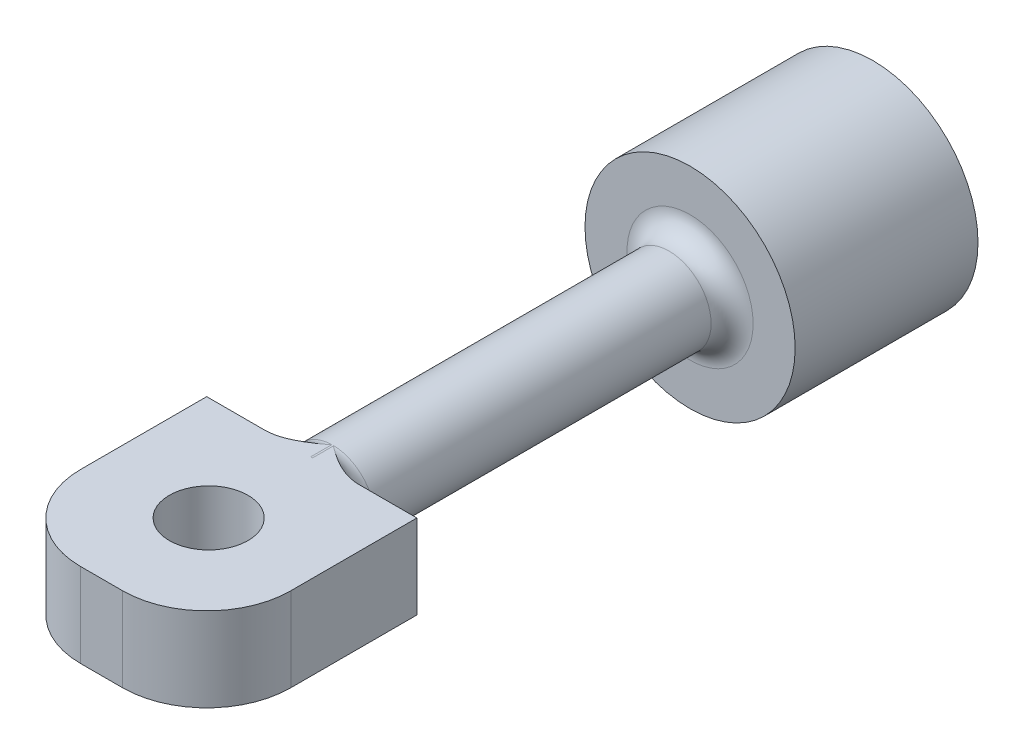
ISO-10303-21;
HEADER;
FILE_DESCRIPTION(('STEP AP214'),'2;1');
FILE_NAME('part.step','',(''),(''),'','','');
FILE_SCHEMA(('AUTOMOTIVE_DESIGN { 1 0 10303 214 1 1 1 1 }'));
ENDSEC;
DATA;
#1=APPLICATION_CONTEXT('core data for automotive mechanical design processes');
#2=APPLICATION_PROTOCOL_DEFINITION('international standard','automotive_design',2000,#1);
#3=PRODUCT_CONTEXT('',#1,'mechanical');
#4=PRODUCT('Part','Part','',(#3));
#5=PRODUCT_RELATED_PRODUCT_CATEGORY('part','',(#4));
#6=PRODUCT_DEFINITION_FORMATION('','',#4);
#7=PRODUCT_DEFINITION_CONTEXT('part definition',#1,'design');
#8=PRODUCT_DEFINITION('design','',#6,#7);
#9=PRODUCT_DEFINITION_SHAPE('','',#8);
#10=(LENGTH_UNIT() NAMED_UNIT(*) SI_UNIT(.MILLI.,.METRE.));
#11=(NAMED_UNIT(*) PLANE_ANGLE_UNIT() SI_UNIT($,.RADIAN.));
#12=(NAMED_UNIT(*) SI_UNIT($,.STERADIAN.) SOLID_ANGLE_UNIT());
#13=UNCERTAINTY_MEASURE_WITH_UNIT(LENGTH_MEASURE(1.E-05),#10,'distance_accuracy_value','');
#14=(GEOMETRIC_REPRESENTATION_CONTEXT(3) GLOBAL_UNCERTAINTY_ASSIGNED_CONTEXT((#13)) GLOBAL_UNIT_ASSIGNED_CONTEXT((#10,
#11,#12)) REPRESENTATION_CONTEXT('',''));
#15=CARTESIAN_POINT('',(0.,0.,0.));
#16=DIRECTION('',(0.,0.,1.));
#17=DIRECTION('',(1.,0.,0.));
#18=AXIS2_PLACEMENT_3D('',#15,#16,#17);
#19=CARTESIAN_POINT('',(-5.60926471851396,0.,11.049));
#20=DIRECTION('',(0.,0.,-1.));
#21=DIRECTION('',(-1.,0.,0.));
#22=AXIS2_PLACEMENT_3D('',#19,#20,#21);
#23=CYLINDRICAL_SURFACE('',#22,6.35);
#24=CARTESIAN_POINT('',(-5.60926471851396,0.,11.049));
#25=DIRECTION('',(0.,0.,1.));
#26=DIRECTION('',(1.,0.,0.));
#27=AXIS2_PLACEMENT_3D('',#24,#25,#26);
#28=CIRCLE('',#27,6.35);
#29=CARTESIAN_POINT('',(0.740735281486041,0.,11.049));
#30=VERTEX_POINT('',#29);
#31=EDGE_CURVE('E201',#30,#30,#28,.T.);
#32=ORIENTED_EDGE('',*,*,#31,.F.);
#33=EDGE_LOOP('',(#32));
#34=FACE_BOUND('',#33,.T.);
#35=CARTESIAN_POINT('',(-5.60926471851396,0.,0.));
#36=DIRECTION('',(0.,0.,1.));
#37=DIRECTION('',(1.,0.,0.));
#38=AXIS2_PLACEMENT_3D('',#35,#36,#37);
#39=CIRCLE('',#38,6.35);
#40=CARTESIAN_POINT('',(0.740735281486041,0.,0.));
#41=VERTEX_POINT('',#40);
#42=EDGE_CURVE('E145',#41,#41,#39,.T.);
#43=ORIENTED_EDGE('',*,*,#42,.T.);
#44=EDGE_LOOP('',(#43));
#45=FACE_BOUND('',#44,.T.);
#46=ADVANCED_FACE('F34',(#34,#45),#23,.T.);
#47=CARTESIAN_POINT('',(-5.60926471851396,0.,11.049));
#48=DIRECTION('',(0.,0.,1.));
#49=DIRECTION('',(1.,0.,0.));
#50=AXIS2_PLACEMENT_3D('',#47,#48,#49);
#51=PLANE('',#50);
#52=CARTESIAN_POINT('',(-5.60926471851396,0.,11.049));
#53=DIRECTION('',(0.,0.,1.));
#54=DIRECTION('',(1.,0.,0.));
#55=AXIS2_PLACEMENT_3D('',#52,#53,#54);
#56=CIRCLE('',#55,3.81);
#57=CARTESIAN_POINT('',(-1.79926471851396,0.,11.049));
#58=VERTEX_POINT('',#57);
#59=EDGE_CURVE('E181',#58,#58,#56,.F.);
#60=ORIENTED_EDGE('',*,*,#59,.T.);
#61=EDGE_LOOP('',(#60));
#62=FACE_BOUND('',#61,.T.);
#63=ORIENTED_EDGE('',*,*,#31,.T.);
#64=EDGE_LOOP('',(#63));
#65=FACE_BOUND('',#64,.T.);
#66=ADVANCED_FACE('F228',(#62,#65),#51,.T.);
#67=CARTESIAN_POINT('',(-5.60926471851396,0.,0.));
#68=DIRECTION('',(0.,0.,1.));
#69=DIRECTION('',(1.,0.,0.));
#70=AXIS2_PLACEMENT_3D('',#67,#68,#69);
#71=PLANE('',#70);
#72=ORIENTED_EDGE('',*,*,#42,.F.);
#73=EDGE_LOOP('',(#72));
#74=FACE_BOUND('',#73,.T.);
#75=ADVANCED_FACE('F225',(#74),#71,.F.);
#76=CARTESIAN_POINT('',(-5.60926471851396,0.,33.909));
#77=DIRECTION('',(0.,0.,-1.));
#78=DIRECTION('',(-1.,0.,0.));
#79=AXIS2_PLACEMENT_3D('',#76,#77,#78);
#80=CYLINDRICAL_SURFACE('',#79,2.54);
#81=CARTESIAN_POINT('',(-5.60926471851396,0.,12.319));
#82=DIRECTION('',(0.,0.,1.));
#83=DIRECTION('',(1.,0.,0.));
#84=AXIS2_PLACEMENT_3D('',#81,#82,#83);
#85=CIRCLE('',#84,2.54);
#86=CARTESIAN_POINT('',(-3.06926471851396,0.,12.319));
#87=VERTEX_POINT('',#86);
#88=EDGE_CURVE('E280',#87,#87,#85,.T.);
#89=ORIENTED_EDGE('',*,*,#88,.T.);
#90=EDGE_LOOP('',(#89));
#91=FACE_BOUND('',#90,.T.);
#92=CARTESIAN_POINT('',(-5.66598428214727,-2.53936663187915,33.909));
#93=DIRECTION('',(1.,0.,0.));
#94=VECTOR('',#93,1.);
#95=LINE('',#92,#94);
#96=CARTESIAN_POINT('',(-5.66598428214727,-2.53936663187915,33.909));
#97=VERTEX_POINT('',#96);
#98=CARTESIAN_POINT('',(-5.55254515488065,-2.53936663187915,33.909));
#99=VERTEX_POINT('',#98);
#100=EDGE_CURVE('E242',#97,#99,#95,.T.);
#101=ORIENTED_EDGE('',*,*,#100,.F.);
#102=DIRECTION('',(0.,0.,-1.));
#103=VECTOR('',#102,1.);
#104=CARTESIAN_POINT('',(-5.66598428214727,-2.53936663187915,33.909));
#105=LINE('',#104,#103);
#106=CARTESIAN_POINT('',(-5.66598428214725,-2.53936663187915,32.6389999999969));
#107=VERTEX_POINT('',#106);
#108=EDGE_CURVE('E63',#97,#107,#105,.T.);
#109=ORIENTED_EDGE('',*,*,#108,.T.);
#110=CARTESIAN_POINT('',(-5.60926471851396,0.,32.639));
#111=DIRECTION('',(0.,0.,1.));
#112=DIRECTION('',(1.,0.,0.));
#113=AXIS2_PLACEMENT_3D('',#110,#111,#112);
#114=CIRCLE('',#113,2.54);
#115=CARTESIAN_POINT('',(-7.50284652250328,1.69291108791943,32.639));
#116=VERTEX_POINT('',#115);
#117=EDGE_CURVE('E277',#107,#116,#114,.F.);
#118=ORIENTED_EDGE('',*,*,#117,.T.);
#119=CARTESIAN_POINT('',(-5.60926471851396,0.,32.639));
#120=DIRECTION('',(0.,0.,1.));
#121=DIRECTION('',(1.,0.,0.));
#122=AXIS2_PLACEMENT_3D('',#119,#120,#121);
#123=CIRCLE('',#122,2.54);
#124=CARTESIAN_POINT('',(-5.66598428214731,2.53936663187915,32.6389999999969));
#125=VERTEX_POINT('',#124);
#126=EDGE_CURVE('E272',#116,#125,#123,.F.);
#127=ORIENTED_EDGE('',*,*,#126,.T.);
#128=DIRECTION('',(0.,0.,-1.));
#129=VECTOR('',#128,1.);
#130=CARTESIAN_POINT('',(-5.66598428214731,2.53936663187915,33.909));
#131=LINE('',#130,#129);
#132=CARTESIAN_POINT('',(-5.66598428214731,2.53936663187915,33.909));
#133=VERTEX_POINT('',#132);
#134=EDGE_CURVE('E268',#125,#133,#131,.F.);
#135=ORIENTED_EDGE('',*,*,#134,.T.);
#136=CARTESIAN_POINT('',(-5.55254515488061,2.53936663187915,33.909));
#137=DIRECTION('',(-1.,0.,0.));
#138=VECTOR('',#137,1.);
#139=LINE('',#136,#138);
#140=CARTESIAN_POINT('',(-5.55254515488061,2.53936663187915,33.909));
#141=VERTEX_POINT('',#140);
#142=EDGE_CURVE('E204',#141,#133,#139,.T.);
#143=ORIENTED_EDGE('',*,*,#142,.F.);
#144=DIRECTION('',(0.,0.,-1.));
#145=VECTOR('',#144,1.);
#146=CARTESIAN_POINT('',(-5.55254515488061,2.53936663187915,33.909));
#147=LINE('',#146,#145);
#148=CARTESIAN_POINT('',(-5.5525451548806,2.53936663187915,32.6389999999969));
#149=VERTEX_POINT('',#148);
#150=EDGE_CURVE('E55',#141,#149,#147,.T.);
#151=ORIENTED_EDGE('',*,*,#150,.T.);
#152=CARTESIAN_POINT('',(-5.60926471851396,0.,32.639));
#153=DIRECTION('',(0.,0.,1.));
#154=DIRECTION('',(1.,0.,0.));
#155=AXIS2_PLACEMENT_3D('',#152,#153,#154);
#156=CIRCLE('',#155,2.54);
#157=CARTESIAN_POINT('',(-3.71568291452464,-1.69291108791943,32.639));
#158=VERTEX_POINT('',#157);
#159=EDGE_CURVE('E265',#149,#158,#156,.F.);
#160=ORIENTED_EDGE('',*,*,#159,.T.);
#161=CARTESIAN_POINT('',(-5.60926471851396,0.,32.639));
#162=DIRECTION('',(0.,0.,1.));
#163=DIRECTION('',(1.,0.,0.));
#164=AXIS2_PLACEMENT_3D('',#161,#162,#163);
#165=CIRCLE('',#164,2.54);
#166=CARTESIAN_POINT('',(-5.55254515488065,-2.53936663187915,32.6389999999969));
#167=VERTEX_POINT('',#166);
#168=EDGE_CURVE('E260',#158,#167,#165,.F.);
#169=ORIENTED_EDGE('',*,*,#168,.T.);
#170=DIRECTION('',(0.,0.,-1.));
#171=VECTOR('',#170,1.);
#172=CARTESIAN_POINT('',(-5.55254515488065,-2.53936663187915,33.909));
#173=LINE('',#172,#171);
#174=EDGE_CURVE('E258',#167,#99,#173,.F.);
#175=ORIENTED_EDGE('',*,*,#174,.T.);
#176=EDGE_LOOP('',(#101,#109,#118,#127,#135,#143,#151,#160,#169,#175));
#177=FACE_BOUND('',#176,.T.);
#178=ADVANCED_FACE('F214',(#91,#177),#80,.T.);
#179=CARTESIAN_POINT('',(0.,0.,33.909));
#180=DIRECTION('',(0.,0.,1.));
#181=DIRECTION('',(1.,0.,0.));
#182=AXIS2_PLACEMENT_3D('',#179,#180,#181);
#183=PLANE('',#182);
#184=DIRECTION('',(-1.,0.,0.));
#185=VECTOR('',#184,1.);
#186=CARTESIAN_POINT('',(-11.959264718514,2.53936663187915,33.909));
#187=LINE('',#186,#185);
#188=CARTESIAN_POINT('',(-8.44963742449794,2.53936663187915,33.909));
#189=VERTEX_POINT('',#188);
#190=CARTESIAN_POINT('',(-11.959264718514,2.53936663187915,33.909));
#191=VERTEX_POINT('',#190);
#192=EDGE_CURVE('E157',#189,#191,#187,.T.);
#193=ORIENTED_EDGE('',*,*,#192,.F.);
#194=CARTESIAN_POINT('',(-5.60926471851396,0.,33.909));
#195=DIRECTION('',(0.,0.,1.));
#196=DIRECTION('',(1.,0.,0.));
#197=AXIS2_PLACEMENT_3D('',#194,#195,#196);
#198=CIRCLE('',#197,3.81);
#199=CARTESIAN_POINT('',(-8.44963742449794,-2.53936663187915,33.909));
#200=VERTEX_POINT('',#199);
#201=EDGE_CURVE('E183',#189,#200,#198,.T.);
#202=ORIENTED_EDGE('',*,*,#201,.T.);
#203=DIRECTION('',(1.,0.,0.));
#204=VECTOR('',#203,1.);
#205=CARTESIAN_POINT('',(-11.959264718514,-2.53936663187915,33.909));
#206=LINE('',#205,#204);
#207=CARTESIAN_POINT('',(-11.959264718514,-2.53936663187915,33.909));
#208=VERTEX_POINT('',#207);
#209=EDGE_CURVE('E188',#208,#200,#206,.T.);
#210=ORIENTED_EDGE('',*,*,#209,.F.);
#211=DIRECTION('',(0.,-1.,0.));
#212=VECTOR('',#211,1.);
#213=CARTESIAN_POINT('',(-11.959264718514,2.53936663187915,33.909));
#214=LINE('',#213,#212);
#215=EDGE_CURVE('E156',#191,#208,#214,.T.);
#216=ORIENTED_EDGE('',*,*,#215,.F.);
#217=EDGE_LOOP('',(#193,#202,#210,#216));
#218=FACE_BOUND('',#217,.T.);
#219=ADVANCED_FACE('F224',(#218),#183,.F.);
#220=CARTESIAN_POINT('',(-2.76889201252998,-2.53936663187915,33.909));
#221=VERTEX_POINT('',#220);
#222=CARTESIAN_POINT('',(0.740735281486043,-2.53936663187915,33.909));
#223=VERTEX_POINT('',#222);
#224=EDGE_CURVE('E186',#221,#223,#206,.T.);
#225=ORIENTED_EDGE('',*,*,#224,.F.);
#226=CARTESIAN_POINT('',(-5.60926471851396,0.,33.909));
#227=DIRECTION('',(0.,0.,1.));
#228=DIRECTION('',(1.,0.,0.));
#229=AXIS2_PLACEMENT_3D('',#226,#227,#228);
#230=CIRCLE('',#229,3.81);
#231=CARTESIAN_POINT('',(-2.76889201252998,2.53936663187915,33.909));
#232=VERTEX_POINT('',#231);
#233=EDGE_CURVE('E155',#221,#232,#230,.T.);
#234=ORIENTED_EDGE('',*,*,#233,.T.);
#235=CARTESIAN_POINT('',(0.740735281486043,2.53936663187915,33.909));
#236=VERTEX_POINT('',#235);
#237=EDGE_CURVE('E139',#236,#232,#187,.T.);
#238=ORIENTED_EDGE('',*,*,#237,.F.);
#239=DIRECTION('',(0.,1.,0.));
#240=VECTOR('',#239,1.);
#241=CARTESIAN_POINT('',(0.740735281486043,2.53936663187915,33.909));
#242=LINE('',#241,#240);
#243=EDGE_CURVE('E153',#223,#236,#242,.T.);
#244=ORIENTED_EDGE('',*,*,#243,.F.);
#245=EDGE_LOOP('',(#225,#234,#238,#244));
#246=FACE_BOUND('',#245,.T.);
#247=ADVANCED_FACE('F152',(#246),#183,.F.);
#248=CARTESIAN_POINT('',(0.740735281486043,2.53936663187915,46.609));
#249=DIRECTION('',(-1.,0.,0.));
#250=DIRECTION('',(0.,-1.,0.));
#251=AXIS2_PLACEMENT_3D('',#248,#249,#250);
#252=PLANE('',#251);
#253=DIRECTION('',(0.,0.,-1.));
#254=VECTOR('',#253,1.);
#255=CARTESIAN_POINT('',(0.740735281486043,2.53936663187915,46.609));
#256=LINE('',#255,#254);
#257=CARTESIAN_POINT('',(0.740735281486043,2.53936663187915,41.529));
#258=VERTEX_POINT('',#257);
#259=EDGE_CURVE('E135',#258,#236,#256,.T.);
#260=ORIENTED_EDGE('',*,*,#259,.F.);
#261=DIRECTION('',(0.,1.,0.));
#262=VECTOR('',#261,1.);
#263=CARTESIAN_POINT('',(0.740735281486042,-2.53936663187915,41.529));
#264=LINE('',#263,#262);
#265=CARTESIAN_POINT('',(0.740735281486043,-2.53936663187915,41.529));
#266=VERTEX_POINT('',#265);
#267=EDGE_CURVE('E244',#258,#266,#264,.F.);
#268=ORIENTED_EDGE('',*,*,#267,.T.);
#269=DIRECTION('',(0.,0.,-1.));
#270=VECTOR('',#269,1.);
#271=CARTESIAN_POINT('',(0.740735281486043,-2.53936663187915,46.609));
#272=LINE('',#271,#270);
#273=EDGE_CURVE('E162',#266,#223,#272,.T.);
#274=ORIENTED_EDGE('',*,*,#273,.T.);
#275=ORIENTED_EDGE('',*,*,#243,.T.);
#276=EDGE_LOOP('',(#260,#268,#274,#275));
#277=FACE_BOUND('',#276,.T.);
#278=ADVANCED_FACE('F160',(#277),#252,.F.);
#279=CARTESIAN_POINT('',(-11.959264718514,2.53936663187915,46.609));
#280=DIRECTION('',(0.,-1.,0.));
#281=DIRECTION('',(0.,0.,-1.));
#282=AXIS2_PLACEMENT_3D('',#279,#280,#281);
#283=PLANE('',#282);
#284=CARTESIAN_POINT('',(-5.55254515488065,2.53936663187915,40.1977087468333));
#285=DIRECTION('',(0.,-1.,0.));
#286=DIRECTION('',(0.,0.,-1.));
#287=AXIS2_PLACEMENT_3D('',#284,#285,#286);
#288=CIRCLE('',#287,2.3749);
#289=CARTESIAN_POINT('',(-5.55254515488065,2.53936663187915,37.8228087468333));
#290=VERTEX_POINT('',#289);
#291=EDGE_CURVE('E163',#290,#290,#288,.T.);
#292=ORIENTED_EDGE('',*,*,#291,.T.);
#293=EDGE_LOOP('',(#292));
#294=FACE_BOUND('',#293,.T.);
#295=DIRECTION('',(0.,0.,-1.));
#296=VECTOR('',#295,1.);
#297=CARTESIAN_POINT('',(-11.959264718514,2.53936663187915,46.609));
#298=LINE('',#297,#296);
#299=CARTESIAN_POINT('',(-11.959264718514,2.53936663187915,41.529));
#300=VERTEX_POINT('',#299);
#301=EDGE_CURVE('E146',#300,#191,#298,.T.);
#302=ORIENTED_EDGE('',*,*,#301,.F.);
#303=CARTESIAN_POINT('',(-6.87926471851396,2.53936663187915,41.529));
#304=DIRECTION('',(0.,-1.,0.));
#305=DIRECTION('',(0.,0.,-1.));
#306=AXIS2_PLACEMENT_3D('',#303,#304,#305);
#307=CIRCLE('',#306,5.08);
#308=CARTESIAN_POINT('',(-6.87926471851396,2.53936663187915,46.609));
#309=VERTEX_POINT('',#308);
#310=EDGE_CURVE('E256',#300,#309,#307,.F.);
#311=ORIENTED_EDGE('',*,*,#310,.T.);
#312=DIRECTION('',(-1.,0.,0.));
#313=VECTOR('',#312,1.);
#314=CARTESIAN_POINT('',(-11.959264718514,2.53936663187915,46.609));
#315=LINE('',#314,#313);
#316=CARTESIAN_POINT('',(-4.33926471851396,2.53936663187915,46.609));
#317=VERTEX_POINT('',#316);
#318=EDGE_CURVE('E198',#317,#309,#315,.T.);
#319=ORIENTED_EDGE('',*,*,#318,.F.);
#320=CARTESIAN_POINT('',(-4.33926471851396,2.53936663187915,41.529));
#321=DIRECTION('',(0.,-1.,0.));
#322=DIRECTION('',(0.,0.,-1.));
#323=AXIS2_PLACEMENT_3D('',#320,#321,#322);
#324=CIRCLE('',#323,5.08);
#325=EDGE_CURVE('E141',#317,#258,#324,.F.);
#326=ORIENTED_EDGE('',*,*,#325,.T.);
#327=ORIENTED_EDGE('',*,*,#259,.T.);
#328=ORIENTED_EDGE('',*,*,#237,.T.);
#329=CARTESIAN_POINT('',(-2.76889201252998,2.53936663187915,33.909));
#330=CARTESIAN_POINT('',(-2.84423560732069,2.53936663187915,33.9089934884778));
#331=CARTESIAN_POINT('',(-2.91948919888659,2.53936663187915,33.9052759550835));
#332=CARTESIAN_POINT('',(-3.069234043186,2.53936663187915,33.8911985392594));
#333=CARTESIAN_POINT('',(-3.14372650338977,2.53936663187915,33.8808517240487));
#334=CARTESIAN_POINT('',(-3.36334254317644,2.53936663187915,33.8414200201185));
#335=CARTESIAN_POINT('',(-3.5069627191833,2.53936663187915,33.8038931842056));
#336=CARTESIAN_POINT('',(-3.80012693225158,2.53936663187915,33.7075924681036));
#337=CARTESIAN_POINT('',(-3.94914602269863,2.53936663187915,33.647291140177));
#338=CARTESIAN_POINT('',(-4.24043046150844,2.53936663187915,33.5119465551635));
#339=CARTESIAN_POINT('',(-4.38268563502947,2.53936663187915,33.4368819100256));
#340=CARTESIAN_POINT('',(-4.59223486458456,2.53936663187915,33.3165041409795));
#341=CARTESIAN_POINT('',(-4.66172108169451,2.53936663187915,33.2748956240633));
#342=CARTESIAN_POINT('',(-4.79945111824655,2.53936663187915,33.1896553124171));
#343=CARTESIAN_POINT('',(-4.86769486827937,2.53936663187915,33.1460234051324));
#344=CARTESIAN_POINT('',(-5.00313014252779,2.53936663187915,33.0572012191372));
#345=CARTESIAN_POINT('',(-5.07032187907455,2.53936663187915,33.0120112609459));
#346=CARTESIAN_POINT('',(-5.20391994508621,2.53936663187915,32.9204884069758));
#347=CARTESIAN_POINT('',(-5.27032637076926,2.53936663187915,32.8741556534069));
#348=CARTESIAN_POINT('',(-5.35824781246202,2.53936663187915,32.8113425500245));
#349=CARTESIAN_POINT('',(-5.38023786834609,2.53936663187915,32.7955080218613));
#350=CARTESIAN_POINT('',(-5.42402444091623,2.53936663187915,32.7635779359338));
#351=CARTESIAN_POINT('',(-5.44582110730311,2.53936663187915,32.7474826134799));
#352=CARTESIAN_POINT('',(-5.48108532969871,2.53936663187915,32.7203121831764));
#353=CARTESIAN_POINT('',(-5.49476386300353,2.53936663187915,32.7094823545308));
#354=CARTESIAN_POINT('',(-5.51903527841538,2.53936663187915,32.6889650593524));
#355=CARTESIAN_POINT('',(-5.52973023432136,2.53936663187915,32.6794378105377));
#356=CARTESIAN_POINT('',(-5.5404262783471,2.53936663187915,32.6666121425604));
#357=CARTESIAN_POINT('',(-5.54196052221437,2.53936663187915,32.6646731049957));
#358=CARTESIAN_POINT('',(-5.5448519041327,2.53936663187915,32.6606573995403));
#359=CARTESIAN_POINT('',(-5.54620859606639,2.53936663187915,32.658580404014));
#360=CARTESIAN_POINT('',(-5.54866583625015,2.53936663187915,32.6542187032587));
#361=CARTESIAN_POINT('',(-5.54976071612866,2.53936663187915,32.6519306735014));
#362=CARTESIAN_POINT('',(-5.55146411819525,2.53936663187915,32.6471869816589));
#363=CARTESIAN_POINT('',(-5.55207675240667,2.53936663187915,32.6447329350068));
#364=CARTESIAN_POINT('',(-5.55255028452025,2.53936663187915,32.6405707843463));
#365=CARTESIAN_POINT('',(-5.55259225339786,2.53936663187915,32.638883047985));
#366=CARTESIAN_POINT('',(-5.55238259641826,2.53936663187915,32.6354969795305));
#367=CARTESIAN_POINT('',(-5.55212596505789,2.53936663187915,32.6337989554248));
#368=CARTESIAN_POINT('',(-5.55172076806956,2.53936663187915,32.6321371907176));
#369=B_SPLINE_CURVE_WITH_KNOTS('',3,(#329,#330,#331,#332,#333,#334,#335,#336,#337,#338,#339,
#340,#341,#342,#343,#344,#345,#346,#347,#348,#349,#350,#351,#352,#353,#354,#355,#356,#357,#358,
#359,#360,#361,#362,#363,#364,#365,#366,#367,#368),.UNSPECIFIED.,.F.,.F.,(4,2,2,2,2,2,2,2,2,2,2,
2,2,2,2,2,2,2,2,4),(0.,0.225800225922263,0.451156732381619,0.894881992238086,1.37610273574317,
1.85802584258481,2.10097699275592,2.34394167378183,2.58685666735858,2.82974158345917,
2.911045607328,2.99227995975572,3.04468826246365,3.08738451368471,3.09479489589499,
3.10222355389191,3.1098008525602,3.11731281911959,3.12235201513204,3.12747691614164),.UNSPECIFIED.);
#370=EDGE_CURVE('E48',#232,#149,#369,.T.);
#371=ORIENTED_EDGE('',*,*,#370,.T.);
#372=ORIENTED_EDGE('',*,*,#150,.F.);
#373=ORIENTED_EDGE('',*,*,#142,.T.);
#374=ORIENTED_EDGE('',*,*,#134,.F.);
#375=CARTESIAN_POINT('',(-8.44963742449794,2.53936663187915,33.909));
#376=CARTESIAN_POINT('',(-8.37429382970722,2.53936663187915,33.9089934884778));
#377=CARTESIAN_POINT('',(-8.29904023814133,2.53936663187915,33.9052759550835));
#378=CARTESIAN_POINT('',(-8.14929539384192,2.53936663187915,33.8911985392594));
#379=CARTESIAN_POINT('',(-8.07480293363814,2.53936663187915,33.8808517240487));
#380=CARTESIAN_POINT('',(-7.85518689385148,2.53936663187915,33.8414200201185));
#381=CARTESIAN_POINT('',(-7.71156671784462,2.53936663187915,33.8038931842056));
#382=CARTESIAN_POINT('',(-7.41840250477635,2.53936663187915,33.7075924681036));
#383=CARTESIAN_POINT('',(-7.2693834143293,2.53936663187915,33.647291140177));
#384=CARTESIAN_POINT('',(-6.97809897551949,2.53936663187915,33.5119465551635));
#385=CARTESIAN_POINT('',(-6.83584380199847,2.53936663187915,33.4368819100256));
#386=CARTESIAN_POINT('',(-6.62629457244338,2.53936663187915,33.3165041409795));
#387=CARTESIAN_POINT('',(-6.55680835533344,2.53936663187915,33.2748956240633));
#388=CARTESIAN_POINT('',(-6.4190783187814,2.53936663187915,33.1896553124172));
#389=CARTESIAN_POINT('',(-6.35083456874858,2.53936663187915,33.1460234051324));
#390=CARTESIAN_POINT('',(-6.21539929450016,2.53936663187915,33.0572012191372));
#391=CARTESIAN_POINT('',(-6.14820755795341,2.53936663187915,33.012011260946));
#392=CARTESIAN_POINT('',(-6.01460949194175,2.53936663187915,32.9204884069758));
#393=CARTESIAN_POINT('',(-5.9482030662587,2.53936663187915,32.874155653407));
#394=CARTESIAN_POINT('',(-5.86028162456596,2.53936663187915,32.8113425500246));
#395=CARTESIAN_POINT('',(-5.83829156868191,2.53936663187915,32.7955080218613));
#396=CARTESIAN_POINT('',(-5.79450499611179,2.53936663187915,32.7635779359339));
#397=CARTESIAN_POINT('',(-5.77270832972493,2.53936663187915,32.74748261348));
#398=CARTESIAN_POINT('',(-5.73744410732932,2.53936663187915,32.7203121831765));
#399=CARTESIAN_POINT('',(-5.72376557402448,2.53936663187915,32.7094823545309));
#400=CARTESIAN_POINT('',(-5.69949415861263,2.53936663187915,32.6889650593525));
#401=CARTESIAN_POINT('',(-5.68879920270666,2.53936663187915,32.6794378105378));
#402=CARTESIAN_POINT('',(-5.67810315868093,2.53936663187915,32.6666121425605));
#403=CARTESIAN_POINT('',(-5.67656891481367,2.53936663187915,32.6646731049958));
#404=CARTESIAN_POINT('',(-5.67367753289533,2.53936663187915,32.6606573995404));
#405=CARTESIAN_POINT('',(-5.67232084096163,2.53936663187915,32.6585804040142));
#406=CARTESIAN_POINT('',(-5.66986360077784,2.53936663187915,32.6542187032589));
#407=CARTESIAN_POINT('',(-5.66876872089932,2.53936663187915,32.6519306735016));
#408=CARTESIAN_POINT('',(-5.66706531883271,2.53936663187915,32.6471869816591));
#409=CARTESIAN_POINT('',(-5.6664526846213,2.53936663187915,32.6447329350069));
#410=CARTESIAN_POINT('',(-5.6659791525077,2.53936663187915,32.6405707843465));
#411=CARTESIAN_POINT('',(-5.66593718363007,2.53936663187915,32.6388830479852));
#412=CARTESIAN_POINT('',(-5.66614684060964,2.53936663187915,32.6354969795307));
#413=CARTESIAN_POINT('',(-5.66640347196999,2.53936663187915,32.6337989554249));
#414=CARTESIAN_POINT('',(-5.6668086689583,2.53936663187915,32.6321371907177));
#415=B_SPLINE_CURVE_WITH_KNOTS('',3,(#375,#376,#377,#378,#379,#380,#381,#382,#383,#384,#385,
#386,#387,#388,#389,#390,#391,#392,#393,#394,#395,#396,#397,#398,#399,#400,#401,#402,#403,#404,
#405,#406,#407,#408,#409,#410,#411,#412,#413,#414),.UNSPECIFIED.,.F.,.F.,(4,2,2,2,2,2,2,2,2,2,2,
2,2,2,2,2,2,2,2,4),(0.,0.225800225922262,0.451156732381618,0.894881992238086,1.37610273574316,
1.85802584258479,2.10097699275588,2.34394167378179,2.58685666735853,2.82974158345911,
2.91104560732788,2.99227995975555,3.04468826246356,3.08738451368452,3.09479489589481,
3.10222355389174,3.10980085256005,3.11731281911945,3.12235201513189,3.12747691614149),.UNSPECIFIED.);
#416=EDGE_CURVE('E353',#125,#189,#415,.F.);
#417=ORIENTED_EDGE('',*,*,#416,.T.);
#418=ORIENTED_EDGE('',*,*,#192,.T.);
#419=EDGE_LOOP('',(#302,#311,#319,#326,#327,#328,#371,#372,#373,#374,#417,#418));
#420=FACE_BOUND('',#419,.T.);
#421=ADVANCED_FACE('F138',(#294,#420),#283,.F.);
#422=CARTESIAN_POINT('',(-11.959264718514,2.53936663187915,46.609));
#423=DIRECTION('',(1.,0.,0.));
#424=DIRECTION('',(0.,0.,-1.));
#425=AXIS2_PLACEMENT_3D('',#422,#423,#424);
#426=PLANE('',#425);
#427=DIRECTION('',(0.,0.,-1.));
#428=VECTOR('',#427,1.);
#429=CARTESIAN_POINT('',(-11.959264718514,-2.53936663187915,46.609));
#430=LINE('',#429,#428);
#431=CARTESIAN_POINT('',(-11.959264718514,-2.53936663187915,41.529));
#432=VERTEX_POINT('',#431);
#433=EDGE_CURVE('E325',#432,#208,#430,.T.);
#434=ORIENTED_EDGE('',*,*,#433,.F.);
#435=DIRECTION('',(0.,-1.,0.));
#436=VECTOR('',#435,1.);
#437=CARTESIAN_POINT('',(-11.959264718514,2.53936663187915,41.529));
#438=LINE('',#437,#436);
#439=EDGE_CURVE('E254',#432,#300,#438,.F.);
#440=ORIENTED_EDGE('',*,*,#439,.T.);
#441=ORIENTED_EDGE('',*,*,#301,.T.);
#442=ORIENTED_EDGE('',*,*,#215,.T.);
#443=EDGE_LOOP('',(#434,#440,#441,#442));
#444=FACE_BOUND('',#443,.T.);
#445=ADVANCED_FACE('F335',(#444),#426,.F.);
#446=CARTESIAN_POINT('',(-11.959264718514,-2.53936663187915,46.609));
#447=DIRECTION('',(0.,1.,0.));
#448=DIRECTION('',(0.,0.,1.));
#449=AXIS2_PLACEMENT_3D('',#446,#447,#448);
#450=PLANE('',#449);
#451=CARTESIAN_POINT('',(-5.55254515488065,-2.53936663187915,40.1977087468333));
#452=DIRECTION('',(0.,-1.,0.));
#453=DIRECTION('',(0.,0.,-1.));
#454=AXIS2_PLACEMENT_3D('',#451,#452,#453);
#455=CIRCLE('',#454,2.3749);
#456=CARTESIAN_POINT('',(-5.55254515488065,-2.53936663187915,37.8228087468333));
#457=VERTEX_POINT('',#456);
#458=EDGE_CURVE('E167',#457,#457,#455,.T.);
#459=ORIENTED_EDGE('',*,*,#458,.F.);
#460=EDGE_LOOP('',(#459));
#461=FACE_BOUND('',#460,.T.);
#462=DIRECTION('',(1.,0.,0.));
#463=VECTOR('',#462,1.);
#464=CARTESIAN_POINT('',(-11.959264718514,-2.53936663187915,46.609));
#465=LINE('',#464,#463);
#466=CARTESIAN_POINT('',(-6.87926471851396,-2.53936663187915,46.609));
#467=VERTEX_POINT('',#466);
#468=CARTESIAN_POINT('',(-4.33926471851396,-2.53936663187915,46.609));
#469=VERTEX_POINT('',#468);
#470=EDGE_CURVE('E171',#467,#469,#465,.T.);
#471=ORIENTED_EDGE('',*,*,#470,.F.);
#472=CARTESIAN_POINT('',(-6.87926471851396,-2.53936663187915,41.529));
#473=DIRECTION('',(0.,1.,0.));
#474=DIRECTION('',(0.,0.,1.));
#475=AXIS2_PLACEMENT_3D('',#472,#473,#474);
#476=CIRCLE('',#475,5.08);
#477=EDGE_CURVE('E252',#467,#432,#476,.F.);
#478=ORIENTED_EDGE('',*,*,#477,.T.);
#479=ORIENTED_EDGE('',*,*,#433,.T.);
#480=ORIENTED_EDGE('',*,*,#209,.T.);
#481=CARTESIAN_POINT('',(-8.44963742449794,-2.53936663187915,33.909));
#482=CARTESIAN_POINT('',(-8.37429382970722,-2.53936663187915,33.9089934884778));
#483=CARTESIAN_POINT('',(-8.29904023814133,-2.53936663187915,33.9052759550835));
#484=CARTESIAN_POINT('',(-8.14929539384192,-2.53936663187915,33.8911985392594));
#485=CARTESIAN_POINT('',(-8.07480293363814,-2.53936663187915,33.8808517240487));
#486=CARTESIAN_POINT('',(-7.85518689385147,-2.53936663187915,33.8414200201185));
#487=CARTESIAN_POINT('',(-7.71156671784462,-2.53936663187915,33.8038931842056));
#488=CARTESIAN_POINT('',(-7.41840250477634,-2.53936663187915,33.7075924681036));
#489=CARTESIAN_POINT('',(-7.26938341432929,-2.53936663187915,33.647291140177));
#490=CARTESIAN_POINT('',(-6.97809897551947,-2.53936663187915,33.5119465551635));
#491=CARTESIAN_POINT('',(-6.83584380199844,-2.53936663187915,33.4368819100256));
#492=CARTESIAN_POINT('',(-6.62629457244335,-2.53936663187915,33.3165041409795));
#493=CARTESIAN_POINT('',(-6.55680835533341,-2.53936663187915,33.2748956240633));
#494=CARTESIAN_POINT('',(-6.41907831878136,-2.53936663187915,33.1896553124171));
#495=CARTESIAN_POINT('',(-6.35083456874854,-2.53936663187915,33.1460234051324));
#496=CARTESIAN_POINT('',(-6.21539929450012,-2.53936663187915,33.0572012191372));
#497=CARTESIAN_POINT('',(-6.14820755795337,-2.53936663187915,33.0120112609459));
#498=CARTESIAN_POINT('',(-6.0146094919417,-2.53936663187915,32.9204884069758));
#499=CARTESIAN_POINT('',(-5.94820306625864,-2.53936663187915,32.8741556534069));
#500=CARTESIAN_POINT('',(-5.86028162456589,-2.53936663187915,32.8113425500245));
#501=CARTESIAN_POINT('',(-5.83829156868184,-2.53936663187915,32.7955080218613));
#502=CARTESIAN_POINT('',(-5.79450499611172,-2.53936663187915,32.7635779359338));
#503=CARTESIAN_POINT('',(-5.77270832972485,-2.53936663187915,32.74748261348));
#504=CARTESIAN_POINT('',(-5.73744410732924,-2.53936663187915,32.7203121831764));
#505=CARTESIAN_POINT('',(-5.72376557402439,-2.53936663187915,32.7094823545308));
#506=CARTESIAN_POINT('',(-5.69949415861247,-2.53936663187915,32.6889650593524));
#507=CARTESIAN_POINT('',(-5.68879920270643,-2.53936663187915,32.6794378105376));
#508=CARTESIAN_POINT('',(-5.67810315868069,-2.53936663187915,32.6666121425603));
#509=CARTESIAN_POINT('',(-5.67656891481343,-2.53936663187915,32.6646731049955));
#510=CARTESIAN_POINT('',(-5.6736775328951,-2.53936663187915,32.6606573995402));
#511=CARTESIAN_POINT('',(-5.6723208409614,-2.53936663187915,32.6585804040139));
#512=CARTESIAN_POINT('',(-5.66986360077766,-2.53936663187915,32.6542187032586));
#513=CARTESIAN_POINT('',(-5.66876872089917,-2.53936663187915,32.6519306735013));
#514=CARTESIAN_POINT('',(-5.66706531883259,-2.53936663187915,32.6471869816588));
#515=CARTESIAN_POINT('',(-5.66645268462117,-2.53936663187915,32.6447329350066));
#516=CARTESIAN_POINT('',(-5.66597915250761,-2.53936663187915,32.6405707843462));
#517=CARTESIAN_POINT('',(-5.66593718363001,-2.53936663187915,32.6388830479849));
#518=CARTESIAN_POINT('',(-5.66614684060963,-2.53936663187915,32.6354969795304));
#519=CARTESIAN_POINT('',(-5.66640347197001,-2.53936663187915,32.6337989554246));
#520=CARTESIAN_POINT('',(-5.66680866895833,-2.53936663187915,32.6321371907175));
#521=B_SPLINE_CURVE_WITH_KNOTS('',3,(#481,#482,#483,#484,#485,#486,#487,#488,#489,#490,#491,
#492,#493,#494,#495,#496,#497,#498,#499,#500,#501,#502,#503,#504,#505,#506,#507,#508,#509,#510,
#511,#512,#513,#514,#515,#516,#517,#518,#519,#520),.UNSPECIFIED.,.F.,.F.,(4,2,2,2,2,2,2,2,2,2,2,
2,2,2,2,2,2,2,2,4),(0.,0.225800225922262,0.45115673238162,0.894881992238086,1.37610273574317,
1.85802584258482,2.10097699275592,2.34394167378183,2.58685666735859,2.82974158345918,
2.91104560732797,2.99227995975564,3.04468826246367,3.08738451368489,3.09479489589517,
3.10222355389208,3.10980085256037,3.11731281911976,3.12235201513222,3.12747691614182),.UNSPECIFIED.);
#522=EDGE_CURVE('E347',#200,#107,#521,.T.);
#523=ORIENTED_EDGE('',*,*,#522,.T.);
#524=ORIENTED_EDGE('',*,*,#108,.F.);
#525=ORIENTED_EDGE('',*,*,#100,.T.);
#526=ORIENTED_EDGE('',*,*,#174,.F.);
#527=CARTESIAN_POINT('',(-2.76889201252998,-2.53936663187915,33.909));
#528=CARTESIAN_POINT('',(-2.8442356073207,-2.53936663187915,33.9089934884778));
#529=CARTESIAN_POINT('',(-2.91948919888659,-2.53936663187915,33.9052759550835));
#530=CARTESIAN_POINT('',(-3.06923404318601,-2.53936663187915,33.8911985392594));
#531=CARTESIAN_POINT('',(-3.14372650338978,-2.53936663187915,33.8808517240487));
#532=CARTESIAN_POINT('',(-3.36334254317645,-2.53936663187915,33.8414200201185));
#533=CARTESIAN_POINT('',(-3.5069627191833,-2.53936663187915,33.8038931842056));
#534=CARTESIAN_POINT('',(-3.80012693225158,-2.53936663187915,33.7075924681036));
#535=CARTESIAN_POINT('',(-3.94914602269863,-2.53936663187915,33.647291140177));
#536=CARTESIAN_POINT('',(-4.24043046150844,-2.53936663187915,33.5119465551635));
#537=CARTESIAN_POINT('',(-4.38268563502947,-2.53936663187915,33.4368819100256));
#538=CARTESIAN_POINT('',(-4.59223486458457,-2.53936663187915,33.3165041409795));
#539=CARTESIAN_POINT('',(-4.66172108169451,-2.53936663187915,33.2748956240633));
#540=CARTESIAN_POINT('',(-4.79945111824656,-2.53936663187915,33.1896553124171));
#541=CARTESIAN_POINT('',(-4.86769486827938,-2.53936663187915,33.1460234051324));
#542=CARTESIAN_POINT('',(-5.00313014252781,-2.53936663187915,33.0572012191372));
#543=CARTESIAN_POINT('',(-5.07032187907456,-2.53936663187915,33.0120112609459));
#544=CARTESIAN_POINT('',(-5.20391994508623,-2.53936663187915,32.9204884069758));
#545=CARTESIAN_POINT('',(-5.27032637076929,-2.53936663187915,32.8741556534069));
#546=CARTESIAN_POINT('',(-5.35824781246207,-2.53936663187915,32.8113425500245));
#547=CARTESIAN_POINT('',(-5.38023786834616,-2.53936663187915,32.7955080218612));
#548=CARTESIAN_POINT('',(-5.42402444091634,-2.53936663187915,32.7635779359337));
#549=CARTESIAN_POINT('',(-5.44582110730325,-2.53936663187915,32.7474826134799));
#550=CARTESIAN_POINT('',(-5.48108532969886,-2.53936663187915,32.7203121831763));
#551=CARTESIAN_POINT('',(-5.49476386300367,-2.53936663187915,32.7094823545307));
#552=CARTESIAN_POINT('',(-5.51903527841552,-2.53936663187915,32.6889650593523));
#553=CARTESIAN_POINT('',(-5.52973023432152,-2.53936663187915,32.6794378105376));
#554=CARTESIAN_POINT('',(-5.54042627834723,-2.53936663187915,32.6666121425603));
#555=CARTESIAN_POINT('',(-5.54196052221448,-2.53936663187915,32.6646731049955));
#556=CARTESIAN_POINT('',(-5.5448519041328,-2.53936663187915,32.6606573995402));
#557=CARTESIAN_POINT('',(-5.54620859606649,-2.53936663187915,32.6585804040139));
#558=CARTESIAN_POINT('',(-5.54866583625025,-2.53936663187915,32.6542187032586));
#559=CARTESIAN_POINT('',(-5.54976071612875,-2.53936663187915,32.6519306735013));
#560=CARTESIAN_POINT('',(-5.55146411819533,-2.53936663187915,32.6471869816588));
#561=CARTESIAN_POINT('',(-5.55207675240672,-2.53936663187915,32.6447329350067));
#562=CARTESIAN_POINT('',(-5.55255028452028,-2.53936663187915,32.6405707843462));
#563=CARTESIAN_POINT('',(-5.5525922533979,-2.53936663187915,32.6388830479849));
#564=CARTESIAN_POINT('',(-5.55238259641829,-2.53936663187915,32.6354969795304));
#565=CARTESIAN_POINT('',(-5.55212596505792,-2.53936663187915,32.6337989554247));
#566=CARTESIAN_POINT('',(-5.55172076806958,-2.53936663187915,32.6321371907175));
#567=B_SPLINE_CURVE_WITH_KNOTS('',3,(#527,#528,#529,#530,#531,#532,#533,#534,#535,#536,#537,
#538,#539,#540,#541,#542,#543,#544,#545,#546,#547,#548,#549,#550,#551,#552,#553,#554,#555,#556,
#557,#558,#559,#560,#561,#562,#563,#564,#565,#566),.UNSPECIFIED.,.F.,.F.,(4,2,2,2,2,2,2,2,2,2,2,
2,2,2,2,2,2,2,2,4),(0.,0.225800225922267,0.451156732381626,0.894881992238086,1.37610273574317,
1.85802584258481,2.10097699275592,2.34394167378184,2.58685666735861,2.82974158345919,
2.91104560732811,2.9922799597559,3.04468826246382,3.08738451368489,3.09479489589516,
3.10222355389206,3.10980085256035,3.11731281911974,3.12235201513218,3.12747691614179),.UNSPECIFIED.);
#568=EDGE_CURVE('E11',#167,#221,#567,.F.);
#569=ORIENTED_EDGE('',*,*,#568,.T.);
#570=ORIENTED_EDGE('',*,*,#224,.T.);
#571=ORIENTED_EDGE('',*,*,#273,.F.);
#572=CARTESIAN_POINT('',(-4.33926471851396,-2.53936663187915,41.529));
#573=DIRECTION('',(0.,1.,0.));
#574=DIRECTION('',(0.,0.,1.));
#575=AXIS2_PLACEMENT_3D('',#572,#573,#574);
#576=CIRCLE('',#575,5.08);
#577=EDGE_CURVE('E246',#266,#469,#576,.F.);
#578=ORIENTED_EDGE('',*,*,#577,.T.);
#579=EDGE_LOOP('',(#471,#478,#479,#480,#523,#524,#525,#526,#569,#570,#571,#578));
#580=FACE_BOUND('',#579,.T.);
#581=ADVANCED_FACE('F324',(#461,#580),#450,.F.);
#582=CARTESIAN_POINT('',(0.,0.,46.609));
#583=DIRECTION('',(0.,0.,1.));
#584=DIRECTION('',(1.,0.,0.));
#585=AXIS2_PLACEMENT_3D('',#582,#583,#584);
#586=PLANE('',#585);
#587=ORIENTED_EDGE('',*,*,#318,.T.);
#588=DIRECTION('',(0.,-1.,0.));
#589=VECTOR('',#588,1.);
#590=CARTESIAN_POINT('',(-6.87926471851396,-2.53936663187915,46.609));
#591=LINE('',#590,#589);
#592=EDGE_CURVE('E249',#309,#467,#591,.T.);
#593=ORIENTED_EDGE('',*,*,#592,.T.);
#594=ORIENTED_EDGE('',*,*,#470,.T.);
#595=DIRECTION('',(0.,1.,0.));
#596=VECTOR('',#595,1.);
#597=CARTESIAN_POINT('',(-4.33926471851396,2.53936663187915,46.609));
#598=LINE('',#597,#596);
#599=EDGE_CURVE('E234',#469,#317,#598,.T.);
#600=ORIENTED_EDGE('',*,*,#599,.T.);
#601=EDGE_LOOP('',(#587,#593,#594,#600));
#602=FACE_BOUND('',#601,.T.);
#603=ADVANCED_FACE('F318',(#602),#586,.T.);
#604=CARTESIAN_POINT('',(-5.55254515488065,10.1606333681209,40.1977087468333));
#605=DIRECTION('',(0.,-1.,0.));
#606=DIRECTION('',(0.,0.,-1.));
#607=AXIS2_PLACEMENT_3D('',#604,#605,#606);
#608=CYLINDRICAL_SURFACE('',#607,2.3749);
#609=ORIENTED_EDGE('',*,*,#458,.T.);
#610=EDGE_LOOP('',(#609));
#611=FACE_BOUND('',#610,.T.);
#612=ORIENTED_EDGE('',*,*,#291,.F.);
#613=EDGE_LOOP('',(#612));
#614=FACE_BOUND('',#613,.T.);
#615=ADVANCED_FACE('F313',(#611,#614),#608,.F.);
#616=CARTESIAN_POINT('',(-4.33926471851396,0.,41.529));
#617=DIRECTION('',(0.,-1.,0.));
#618=DIRECTION('',(1.,0.,0.));
#619=AXIS2_PLACEMENT_3D('',#616,#617,#618);
#620=CYLINDRICAL_SURFACE('',#619,5.08);
#621=ORIENTED_EDGE('',*,*,#577,.F.);
#622=ORIENTED_EDGE('',*,*,#267,.F.);
#623=ORIENTED_EDGE('',*,*,#325,.F.);
#624=ORIENTED_EDGE('',*,*,#599,.F.);
#625=EDGE_LOOP('',(#621,#622,#623,#624));
#626=FACE_BOUND('',#625,.T.);
#627=ADVANCED_FACE('F300',(#626),#620,.T.);
#628=CARTESIAN_POINT('',(-6.87926471851396,0.,41.529));
#629=DIRECTION('',(0.,1.,0.));
#630=DIRECTION('',(0.,0.,1.));
#631=AXIS2_PLACEMENT_3D('',#628,#629,#630);
#632=CYLINDRICAL_SURFACE('',#631,5.08);
#633=ORIENTED_EDGE('',*,*,#310,.F.);
#634=ORIENTED_EDGE('',*,*,#439,.F.);
#635=ORIENTED_EDGE('',*,*,#477,.F.);
#636=ORIENTED_EDGE('',*,*,#592,.F.);
#637=EDGE_LOOP('',(#633,#634,#635,#636));
#638=FACE_BOUND('',#637,.T.);
#639=ADVANCED_FACE('F293',(#638),#632,.T.);
#640=CARTESIAN_POINT('',(-5.60926471851396,0.,12.319));
#641=DIRECTION('',(0.,0.,1.));
#642=DIRECTION('',(1.,0.,0.));
#643=AXIS2_PLACEMENT_3D('',#640,#641,#642);
#644=TOROIDAL_SURFACE('',#643,3.81,1.27);
#645=ORIENTED_EDGE('',*,*,#59,.F.);
#646=EDGE_LOOP('',(#645));
#647=FACE_BOUND('',#646,.T.);
#648=ORIENTED_EDGE('',*,*,#88,.F.);
#649=EDGE_LOOP('',(#648));
#650=FACE_BOUND('',#649,.T.);
#651=ADVANCED_FACE('F289',(#647,#650),#644,.F.);
#652=CARTESIAN_POINT('',(-5.60926471851396,0.,32.639));
#653=DIRECTION('',(0.,0.,1.));
#654=DIRECTION('',(1.,0.,0.));
#655=AXIS2_PLACEMENT_3D('',#652,#653,#654);
#656=TOROIDAL_SURFACE('',#655,3.81,1.27);
#657=ORIENTED_EDGE('',*,*,#126,.F.);
#658=ORIENTED_EDGE('',*,*,#117,.F.);
#659=ORIENTED_EDGE('',*,*,#522,.F.);
#660=ORIENTED_EDGE('',*,*,#201,.F.);
#661=ORIENTED_EDGE('',*,*,#416,.F.);
#662=EDGE_LOOP('',(#657,#658,#659,#660,#661));
#663=FACE_BOUND('',#662,.T.);
#664=ADVANCED_FACE('F292',(#663),#656,.F.);
#665=CARTESIAN_POINT('',(-5.60926471851396,0.,32.639));
#666=DIRECTION('',(0.,0.,1.));
#667=DIRECTION('',(1.,0.,0.));
#668=AXIS2_PLACEMENT_3D('',#665,#666,#667);
#669=TOROIDAL_SURFACE('',#668,3.81,1.27);
#670=ORIENTED_EDGE('',*,*,#168,.F.);
#671=ORIENTED_EDGE('',*,*,#159,.F.);
#672=ORIENTED_EDGE('',*,*,#370,.F.);
#673=ORIENTED_EDGE('',*,*,#233,.F.);
#674=ORIENTED_EDGE('',*,*,#568,.F.);
#675=EDGE_LOOP('',(#670,#671,#672,#673,#674));
#676=FACE_BOUND('',#675,.T.);
#677=ADVANCED_FACE('F36',(#676),#669,.F.);
#678=CLOSED_SHELL('',(#46,#66,#75,#178,#219,#247,#278,#421,#445,#581,#603,#615,#627,#639,#651,
#664,#677));
#679=MANIFOLD_SOLID_BREP('B2',#678);
#680=ADVANCED_BREP_SHAPE_REPRESENTATION('',(#18,#679),#14);
#681=SHAPE_DEFINITION_REPRESENTATION(#9,#680);
ENDSEC;
END-ISO-10303-21;
